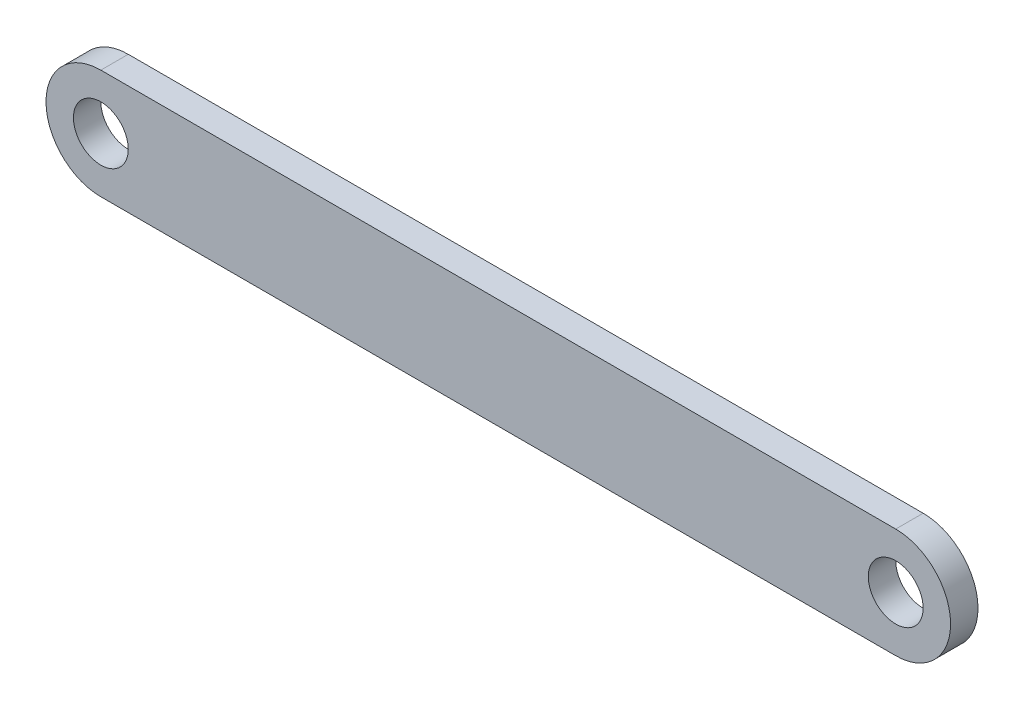
ISO-10303-21;
HEADER;
FILE_DESCRIPTION(('STEP AP214'),'2;1');
FILE_NAME('part.step','',(''),(''),'','','');
FILE_SCHEMA(('AUTOMOTIVE_DESIGN { 1 0 10303 214 1 1 1 1 }'));
ENDSEC;
DATA;
#1=APPLICATION_CONTEXT('core data for automotive mechanical design processes');
#2=APPLICATION_PROTOCOL_DEFINITION('international standard','automotive_design',2000,#1);
#3=PRODUCT_CONTEXT('',#1,'mechanical');
#4=PRODUCT('Part','Part','',(#3));
#5=PRODUCT_RELATED_PRODUCT_CATEGORY('part','',(#4));
#6=PRODUCT_DEFINITION_FORMATION('','',#4);
#7=PRODUCT_DEFINITION_CONTEXT('part definition',#1,'design');
#8=PRODUCT_DEFINITION('design','',#6,#7);
#9=PRODUCT_DEFINITION_SHAPE('','',#8);
#10=(LENGTH_UNIT() NAMED_UNIT(*) SI_UNIT(.MILLI.,.METRE.));
#11=(NAMED_UNIT(*) PLANE_ANGLE_UNIT() SI_UNIT($,.RADIAN.));
#12=(NAMED_UNIT(*) SI_UNIT($,.STERADIAN.) SOLID_ANGLE_UNIT());
#13=UNCERTAINTY_MEASURE_WITH_UNIT(LENGTH_MEASURE(1.E-05),#10,'distance_accuracy_value','');
#14=(GEOMETRIC_REPRESENTATION_CONTEXT(3) GLOBAL_UNCERTAINTY_ASSIGNED_CONTEXT((#13)) GLOBAL_UNIT_ASSIGNED_CONTEXT((#10,
#11,#12)) REPRESENTATION_CONTEXT('',''));
#15=CARTESIAN_POINT('',(0.,0.,0.));
#16=DIRECTION('',(0.,0.,1.));
#17=DIRECTION('',(1.,0.,0.));
#18=AXIS2_PLACEMENT_3D('',#15,#16,#17);
#19=CARTESIAN_POINT('',(0.,2.,1.));
#20=DIRECTION('',(0.,1.,0.));
#21=DIRECTION('',(-1.,0.,0.));
#22=AXIS2_PLACEMENT_3D('',#19,#20,#21);
#23=PLANE('',#22);
#24=DIRECTION('',(1.,0.,0.));
#25=VECTOR('',#24,1.);
#26=CARTESIAN_POINT('',(0.,2.,0.));
#27=LINE('',#26,#25);
#28=CARTESIAN_POINT('',(-28.986,2.,0.));
#29=VERTEX_POINT('',#28);
#30=CARTESIAN_POINT('',(0.,2.,0.));
#31=VERTEX_POINT('',#30);
#32=EDGE_CURVE('E108',#29,#31,#27,.T.);
#33=ORIENTED_EDGE('',*,*,#32,.F.);
#34=DIRECTION('',(0.,0.,-1.));
#35=VECTOR('',#34,1.);
#36=CARTESIAN_POINT('',(-28.986,2.,1.));
#37=LINE('',#36,#35);
#38=CARTESIAN_POINT('',(-28.986,2.,1.));
#39=VERTEX_POINT('',#38);
#40=EDGE_CURVE('E11',#39,#29,#37,.T.);
#41=ORIENTED_EDGE('',*,*,#40,.F.);
#42=DIRECTION('',(1.,0.,0.));
#43=VECTOR('',#42,1.);
#44=CARTESIAN_POINT('',(0.,2.,1.));
#45=LINE('',#44,#43);
#46=CARTESIAN_POINT('',(0.,2.,1.));
#47=VERTEX_POINT('',#46);
#48=EDGE_CURVE('E90',#39,#47,#45,.T.);
#49=ORIENTED_EDGE('',*,*,#48,.T.);
#50=DIRECTION('',(0.,0.,-1.));
#51=VECTOR('',#50,1.);
#52=CARTESIAN_POINT('',(0.,2.,1.));
#53=LINE('',#52,#51);
#54=EDGE_CURVE('E78',#47,#31,#53,.T.);
#55=ORIENTED_EDGE('',*,*,#54,.T.);
#56=EDGE_LOOP('',(#33,#41,#49,#55));
#57=FACE_BOUND('',#56,.T.);
#58=ADVANCED_FACE('F39',(#57),#23,.T.);
#59=CARTESIAN_POINT('',(-28.986,0.,1.));
#60=DIRECTION('',(0.,0.,-1.));
#61=DIRECTION('',(-1.,0.,0.));
#62=AXIS2_PLACEMENT_3D('',#59,#60,#61);
#63=CYLINDRICAL_SURFACE('',#62,2.);
#64=CARTESIAN_POINT('',(-28.986,0.,0.));
#65=DIRECTION('',(0.,0.,1.));
#66=DIRECTION('',(1.,0.,0.));
#67=AXIS2_PLACEMENT_3D('',#64,#65,#66);
#68=CIRCLE('',#67,2.);
#69=CARTESIAN_POINT('',(-28.986,-2.,0.));
#70=VERTEX_POINT('',#69);
#71=EDGE_CURVE('E95',#29,#70,#68,.T.);
#72=ORIENTED_EDGE('',*,*,#71,.T.);
#73=DIRECTION('',(0.,0.,-1.));
#74=VECTOR('',#73,1.);
#75=CARTESIAN_POINT('',(-28.986,-2.,1.));
#76=LINE('',#75,#74);
#77=CARTESIAN_POINT('',(-28.986,-2.,1.));
#78=VERTEX_POINT('',#77);
#79=EDGE_CURVE('E47',#78,#70,#76,.T.);
#80=ORIENTED_EDGE('',*,*,#79,.F.);
#81=CARTESIAN_POINT('',(-28.986,0.,1.));
#82=DIRECTION('',(0.,0.,1.));
#83=DIRECTION('',(1.,0.,0.));
#84=AXIS2_PLACEMENT_3D('',#81,#82,#83);
#85=CIRCLE('',#84,2.);
#86=EDGE_CURVE('E84',#39,#78,#85,.T.);
#87=ORIENTED_EDGE('',*,*,#86,.F.);
#88=ORIENTED_EDGE('',*,*,#40,.T.);
#89=EDGE_LOOP('',(#72,#80,#87,#88));
#90=FACE_BOUND('',#89,.T.);
#91=ADVANCED_FACE('F93',(#90),#63,.T.);
#92=CARTESIAN_POINT('',(0.,-2.,1.));
#93=DIRECTION('',(0.,1.,0.));
#94=DIRECTION('',(-1.,0.,0.));
#95=AXIS2_PLACEMENT_3D('',#92,#93,#94);
#96=PLANE('',#95);
#97=DIRECTION('',(1.,0.,0.));
#98=VECTOR('',#97,1.);
#99=CARTESIAN_POINT('',(0.,-2.,0.));
#100=LINE('',#99,#98);
#101=CARTESIAN_POINT('',(0.,-2.,0.));
#102=VERTEX_POINT('',#101);
#103=EDGE_CURVE('E71',#70,#102,#100,.T.);
#104=ORIENTED_EDGE('',*,*,#103,.T.);
#105=DIRECTION('',(0.,0.,-1.));
#106=VECTOR('',#105,1.);
#107=CARTESIAN_POINT('',(0.,-2.,1.));
#108=LINE('',#107,#106);
#109=CARTESIAN_POINT('',(0.,-2.,1.));
#110=VERTEX_POINT('',#109);
#111=EDGE_CURVE('E96',#110,#102,#108,.T.);
#112=ORIENTED_EDGE('',*,*,#111,.F.);
#113=DIRECTION('',(1.,0.,0.));
#114=VECTOR('',#113,1.);
#115=CARTESIAN_POINT('',(0.,-2.,1.));
#116=LINE('',#115,#114);
#117=EDGE_CURVE('E89',#78,#110,#116,.T.);
#118=ORIENTED_EDGE('',*,*,#117,.F.);
#119=ORIENTED_EDGE('',*,*,#79,.T.);
#120=EDGE_LOOP('',(#104,#112,#118,#119));
#121=FACE_BOUND('',#120,.T.);
#122=ADVANCED_FACE('F97',(#121),#96,.F.);
#123=CARTESIAN_POINT('',(0.,0.,1.));
#124=DIRECTION('',(0.,0.,-1.));
#125=DIRECTION('',(-1.,0.,0.));
#126=AXIS2_PLACEMENT_3D('',#123,#124,#125);
#127=CYLINDRICAL_SURFACE('',#126,1.);
#128=CARTESIAN_POINT('',(0.,0.,1.));
#129=DIRECTION('',(0.,0.,1.));
#130=DIRECTION('',(1.,0.,0.));
#131=AXIS2_PLACEMENT_3D('',#128,#129,#130);
#132=CIRCLE('',#131,1.);
#133=CARTESIAN_POINT('',(1.,0.,1.));
#134=VERTEX_POINT('',#133);
#135=EDGE_CURVE('E99',#134,#134,#132,.T.);
#136=ORIENTED_EDGE('',*,*,#135,.T.);
#137=EDGE_LOOP('',(#136));
#138=FACE_BOUND('',#137,.T.);
#139=CARTESIAN_POINT('',(0.,0.,0.));
#140=DIRECTION('',(0.,0.,1.));
#141=DIRECTION('',(1.,0.,0.));
#142=AXIS2_PLACEMENT_3D('',#139,#140,#141);
#143=CIRCLE('',#142,1.);
#144=CARTESIAN_POINT('',(1.,0.,0.));
#145=VERTEX_POINT('',#144);
#146=EDGE_CURVE('E115',#145,#145,#143,.T.);
#147=ORIENTED_EDGE('',*,*,#146,.F.);
#148=EDGE_LOOP('',(#147));
#149=FACE_BOUND('',#148,.T.);
#150=ADVANCED_FACE('F135',(#138,#149),#127,.F.);
#151=CARTESIAN_POINT('',(0.,0.,1.));
#152=DIRECTION('',(0.,0.,-1.));
#153=DIRECTION('',(-1.,0.,0.));
#154=AXIS2_PLACEMENT_3D('',#151,#152,#153);
#155=CYLINDRICAL_SURFACE('',#154,2.);
#156=CARTESIAN_POINT('',(0.,0.,0.));
#157=DIRECTION('',(0.,0.,1.));
#158=DIRECTION('',(1.,0.,0.));
#159=AXIS2_PLACEMENT_3D('',#156,#157,#158);
#160=CIRCLE('',#159,2.);
#161=EDGE_CURVE('E113',#102,#31,#160,.T.);
#162=ORIENTED_EDGE('',*,*,#161,.T.);
#163=ORIENTED_EDGE('',*,*,#54,.F.);
#164=CARTESIAN_POINT('',(0.,0.,1.));
#165=DIRECTION('',(0.,0.,1.));
#166=DIRECTION('',(1.,0.,0.));
#167=AXIS2_PLACEMENT_3D('',#164,#165,#166);
#168=CIRCLE('',#167,2.);
#169=EDGE_CURVE('E55',#110,#47,#168,.T.);
#170=ORIENTED_EDGE('',*,*,#169,.F.);
#171=ORIENTED_EDGE('',*,*,#111,.T.);
#172=EDGE_LOOP('',(#162,#163,#170,#171));
#173=FACE_BOUND('',#172,.T.);
#174=ADVANCED_FACE('F124',(#173),#155,.T.);
#175=CARTESIAN_POINT('',(-28.986,0.,1.));
#176=DIRECTION('',(0.,0.,-1.));
#177=DIRECTION('',(-1.,0.,0.));
#178=AXIS2_PLACEMENT_3D('',#175,#176,#177);
#179=CYLINDRICAL_SURFACE('',#178,1.);
#180=CARTESIAN_POINT('',(-28.986,0.,1.));
#181=DIRECTION('',(0.,0.,1.));
#182=DIRECTION('',(1.,0.,0.));
#183=AXIS2_PLACEMENT_3D('',#180,#181,#182);
#184=CIRCLE('',#183,1.);
#185=CARTESIAN_POINT('',(-27.986,0.,1.));
#186=VERTEX_POINT('',#185);
#187=EDGE_CURVE('E105',#186,#186,#184,.T.);
#188=ORIENTED_EDGE('',*,*,#187,.T.);
#189=EDGE_LOOP('',(#188));
#190=FACE_BOUND('',#189,.T.);
#191=CARTESIAN_POINT('',(-28.986,0.,0.));
#192=DIRECTION('',(0.,0.,1.));
#193=DIRECTION('',(1.,0.,0.));
#194=AXIS2_PLACEMENT_3D('',#191,#192,#193);
#195=CIRCLE('',#194,1.);
#196=CARTESIAN_POINT('',(-27.986,0.,0.));
#197=VERTEX_POINT('',#196);
#198=EDGE_CURVE('E118',#197,#197,#195,.T.);
#199=ORIENTED_EDGE('',*,*,#198,.F.);
#200=EDGE_LOOP('',(#199));
#201=FACE_BOUND('',#200,.T.);
#202=ADVANCED_FACE('F140',(#190,#201),#179,.F.);
#203=CARTESIAN_POINT('',(0.,0.,1.));
#204=DIRECTION('',(0.,0.,1.));
#205=DIRECTION('',(1.,0.,0.));
#206=AXIS2_PLACEMENT_3D('',#203,#204,#205);
#207=PLANE('',#206);
#208=ORIENTED_EDGE('',*,*,#48,.F.);
#209=ORIENTED_EDGE('',*,*,#86,.T.);
#210=ORIENTED_EDGE('',*,*,#117,.T.);
#211=ORIENTED_EDGE('',*,*,#169,.T.);
#212=EDGE_LOOP('',(#208,#209,#210,#211));
#213=FACE_BOUND('',#212,.T.);
#214=ORIENTED_EDGE('',*,*,#135,.F.);
#215=EDGE_LOOP('',(#214));
#216=FACE_BOUND('',#215,.T.);
#217=ORIENTED_EDGE('',*,*,#187,.F.);
#218=EDGE_LOOP('',(#217));
#219=FACE_BOUND('',#218,.T.);
#220=ADVANCED_FACE('F86',(#213,#216,#219),#207,.T.);
#221=CARTESIAN_POINT('',(0.,0.,0.));
#222=DIRECTION('',(0.,0.,1.));
#223=DIRECTION('',(1.,0.,0.));
#224=AXIS2_PLACEMENT_3D('',#221,#222,#223);
#225=PLANE('',#224);
#226=ORIENTED_EDGE('',*,*,#32,.T.);
#227=ORIENTED_EDGE('',*,*,#161,.F.);
#228=ORIENTED_EDGE('',*,*,#103,.F.);
#229=ORIENTED_EDGE('',*,*,#71,.F.);
#230=EDGE_LOOP('',(#226,#227,#228,#229));
#231=FACE_BOUND('',#230,.T.);
#232=ORIENTED_EDGE('',*,*,#146,.T.);
#233=EDGE_LOOP('',(#232));
#234=FACE_BOUND('',#233,.T.);
#235=ORIENTED_EDGE('',*,*,#198,.T.);
#236=EDGE_LOOP('',(#235));
#237=FACE_BOUND('',#236,.T.);
#238=ADVANCED_FACE('F126',(#231,#234,#237),#225,.F.);
#239=CLOSED_SHELL('',(#58,#91,#122,#150,#174,#202,#220,#238));
#240=MANIFOLD_SOLID_BREP('B2',#239);
#241=ADVANCED_BREP_SHAPE_REPRESENTATION('',(#18,#240),#14);
#242=SHAPE_DEFINITION_REPRESENTATION(#9,#241);
ENDSEC;
END-ISO-10303-21;
